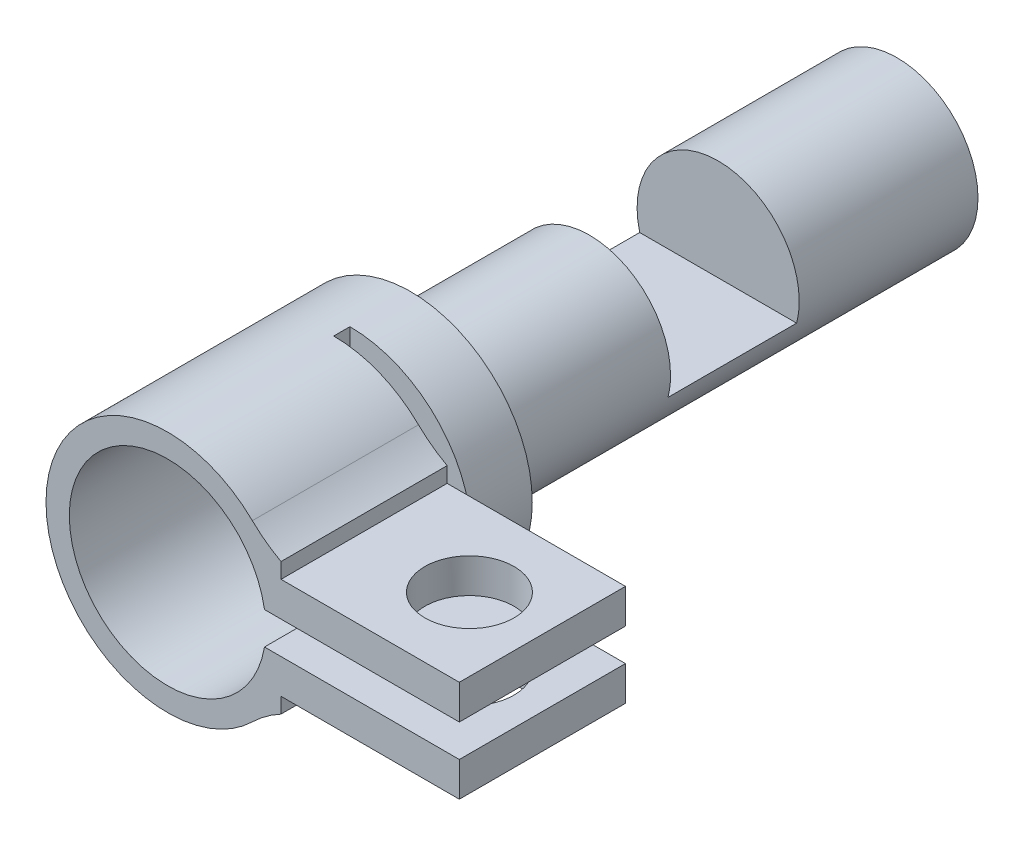
ISO-10303-21;
HEADER;
FILE_DESCRIPTION(('STEP AP214'),'2;1');
FILE_NAME('part.step','',(''),(''),'','','');
FILE_SCHEMA(('AUTOMOTIVE_DESIGN { 1 0 10303 214 1 1 1 1 }'));
ENDSEC;
DATA;
#1=APPLICATION_CONTEXT('core data for automotive mechanical design processes');
#2=APPLICATION_PROTOCOL_DEFINITION('international standard','automotive_design',2000,#1);
#3=PRODUCT_CONTEXT('',#1,'mechanical');
#4=PRODUCT('Part','Part','',(#3));
#5=PRODUCT_RELATED_PRODUCT_CATEGORY('part','',(#4));
#6=PRODUCT_DEFINITION_FORMATION('','',#4);
#7=PRODUCT_DEFINITION_CONTEXT('part definition',#1,'design');
#8=PRODUCT_DEFINITION('design','',#6,#7);
#9=PRODUCT_DEFINITION_SHAPE('','',#8);
#10=(LENGTH_UNIT() NAMED_UNIT(*) SI_UNIT(.MILLI.,.METRE.));
#11=(NAMED_UNIT(*) PLANE_ANGLE_UNIT() SI_UNIT($,.RADIAN.));
#12=(NAMED_UNIT(*) SI_UNIT($,.STERADIAN.) SOLID_ANGLE_UNIT());
#13=UNCERTAINTY_MEASURE_WITH_UNIT(LENGTH_MEASURE(1.E-05),#10,'distance_accuracy_value','');
#14=(GEOMETRIC_REPRESENTATION_CONTEXT(3) GLOBAL_UNCERTAINTY_ASSIGNED_CONTEXT((#13)) GLOBAL_UNIT_ASSIGNED_CONTEXT((#10,
#11,#12)) REPRESENTATION_CONTEXT('',''));
#15=CARTESIAN_POINT('',(0.,0.,0.));
#16=DIRECTION('',(0.,0.,1.));
#17=DIRECTION('',(1.,0.,0.));
#18=AXIS2_PLACEMENT_3D('',#15,#16,#17);
#19=CARTESIAN_POINT('',(0.,3.,0.));
#20=DIRECTION('',(0.,0.,-1.));
#21=DIRECTION('',(-1.,0.,0.));
#22=AXIS2_PLACEMENT_3D('',#19,#20,#21);
#23=PLANE('',#22);
#24=CARTESIAN_POINT('',(4.30697109347161,-4.425,0.));
#25=DIRECTION('',(0.,0.,-1.));
#26=DIRECTION('',(-1.,0.,0.));
#27=AXIS2_PLACEMENT_3D('',#24,#25,#26);
#28=CIRCLE('',#27,3.175);
#29=CARTESIAN_POINT('',(2.09245559197001,-2.1497975708502,0.));
#30=VERTEX_POINT('',#29);
#31=CARTESIAN_POINT('',(2.8,-1.63042255010869,0.));
#32=VERTEX_POINT('',#31);
#33=EDGE_CURVE('E63',#30,#32,#28,.T.);
#34=ORIENTED_EDGE('',*,*,#33,.T.);
#35=DIRECTION('',(0.,1.,0.));
#36=VECTOR('',#35,1.);
#37=CARTESIAN_POINT('',(2.8,-3.001,0.));
#38=LINE('',#37,#36);
#39=CARTESIAN_POINT('',(2.8,-1.25,0.));
#40=VERTEX_POINT('',#39);
#41=EDGE_CURVE('E203',#32,#40,#38,.T.);
#42=ORIENTED_EDGE('',*,*,#41,.T.);
#43=DIRECTION('',(1.,0.,0.));
#44=VECTOR('',#43,1.);
#45=CARTESIAN_POINT('',(7.2,-1.25,0.));
#46=LINE('',#45,#44);
#47=CARTESIAN_POINT('',(7.2,-1.25,0.));
#48=VERTEX_POINT('',#47);
#49=EDGE_CURVE('E188',#40,#48,#46,.T.);
#50=ORIENTED_EDGE('',*,*,#49,.T.);
#51=DIRECTION('',(0.,-1.,0.));
#52=VECTOR('',#51,1.);
#53=CARTESIAN_POINT('',(7.2,1.25,0.));
#54=LINE('',#53,#52);
#55=CARTESIAN_POINT('',(7.2,-0.4,0.));
#56=VERTEX_POINT('',#55);
#57=EDGE_CURVE('E328',#56,#48,#54,.T.);
#58=ORIENTED_EDGE('',*,*,#57,.F.);
#59=DIRECTION('',(1.,0.,0.));
#60=VECTOR('',#59,1.);
#61=CARTESIAN_POINT('',(0.,-0.4,0.));
#62=LINE('',#61,#60);
#63=CARTESIAN_POINT('',(2.3917828078653,-0.4,0.));
#64=VERTEX_POINT('',#63);
#65=EDGE_CURVE('E303',#64,#56,#62,.T.);
#66=ORIENTED_EDGE('',*,*,#65,.F.);
#67=CARTESIAN_POINT('',(0.,0.,0.));
#68=DIRECTION('',(0.,0.,1.));
#69=DIRECTION('',(1.,0.,0.));
#70=AXIS2_PLACEMENT_3D('',#67,#68,#69);
#71=CIRCLE('',#70,2.425);
#72=CARTESIAN_POINT('',(2.3917828078653,0.4,0.));
#73=VERTEX_POINT('',#72);
#74=EDGE_CURVE('E343',#73,#64,#71,.T.);
#75=ORIENTED_EDGE('',*,*,#74,.F.);
#76=DIRECTION('',(1.,0.,0.));
#77=VECTOR('',#76,1.);
#78=CARTESIAN_POINT('',(0.,0.4,0.));
#79=LINE('',#78,#77);
#80=CARTESIAN_POINT('',(7.2,0.4,0.));
#81=VERTEX_POINT('',#80);
#82=EDGE_CURVE('E302',#73,#81,#79,.T.);
#83=ORIENTED_EDGE('',*,*,#82,.T.);
#84=CARTESIAN_POINT('',(7.2,1.25,0.));
#85=VERTEX_POINT('',#84);
#86=EDGE_CURVE('E332',#85,#81,#54,.T.);
#87=ORIENTED_EDGE('',*,*,#86,.F.);
#88=DIRECTION('',(1.,0.,0.));
#89=VECTOR('',#88,1.);
#90=CARTESIAN_POINT('',(3.,1.25,0.));
#91=LINE('',#90,#89);
#92=CARTESIAN_POINT('',(2.8,1.25,0.));
#93=VERTEX_POINT('',#92);
#94=EDGE_CURVE('E322',#93,#85,#91,.T.);
#95=ORIENTED_EDGE('',*,*,#94,.F.);
#96=DIRECTION('',(0.,-1.,0.));
#97=VECTOR('',#96,1.);
#98=CARTESIAN_POINT('',(2.8,3.001,0.));
#99=LINE('',#98,#97);
#100=CARTESIAN_POINT('',(2.8,1.63042255010869,0.));
#101=VERTEX_POINT('',#100);
#102=EDGE_CURVE('E222',#101,#93,#99,.T.);
#103=ORIENTED_EDGE('',*,*,#102,.F.);
#104=CARTESIAN_POINT('',(4.30697109347161,4.425,0.));
#105=DIRECTION('',(0.,0.,-1.));
#106=DIRECTION('',(-1.,0.,0.));
#107=AXIS2_PLACEMENT_3D('',#104,#105,#106);
#108=CIRCLE('',#107,3.175);
#109=CARTESIAN_POINT('',(2.09245559197001,2.1497975708502,0.));
#110=VERTEX_POINT('',#109);
#111=EDGE_CURVE('E71',#101,#110,#108,.T.);
#112=ORIENTED_EDGE('',*,*,#111,.T.);
#113=CARTESIAN_POINT('',(0.,0.,0.));
#114=DIRECTION('',(0.,0.,1.));
#115=DIRECTION('',(1.,0.,0.));
#116=AXIS2_PLACEMENT_3D('',#113,#114,#115);
#117=CIRCLE('',#116,3.);
#118=EDGE_CURVE('E347',#110,#30,#117,.T.);
#119=ORIENTED_EDGE('',*,*,#118,.T.);
#120=EDGE_LOOP('',(#34,#42,#50,#58,#66,#75,#83,#87,#95,#103,#112,#119));
#121=FACE_BOUND('',#120,.T.);
#122=ADVANCED_FACE('F46',(#121),#23,.F.);
#123=CARTESIAN_POINT('',(0.,0.,-4.1));
#124=DIRECTION('',(0.,0.,-1.));
#125=DIRECTION('',(-1.,0.,0.));
#126=AXIS2_PLACEMENT_3D('',#123,#124,#125);
#127=PLANE('',#126);
#128=CARTESIAN_POINT('',(4.30697109347161,4.425,-4.1));
#129=DIRECTION('',(0.,0.,-1.));
#130=DIRECTION('',(-1.,0.,0.));
#131=AXIS2_PLACEMENT_3D('',#128,#129,#130);
#132=CIRCLE('',#131,3.175);
#133=CARTESIAN_POINT('',(2.09245559197001,2.1497975708502,-4.1));
#134=VERTEX_POINT('',#133);
#135=CARTESIAN_POINT('',(2.8,1.63042255010869,-4.1));
#136=VERTEX_POINT('',#135);
#137=EDGE_CURVE('E473',#134,#136,#132,.F.);
#138=ORIENTED_EDGE('',*,*,#137,.T.);
#139=DIRECTION('',(0.,-1.,0.));
#140=VECTOR('',#139,1.);
#141=CARTESIAN_POINT('',(2.8,3.001,-4.1));
#142=LINE('',#141,#140);
#143=CARTESIAN_POINT('',(2.8,1.25,-4.1));
#144=VERTEX_POINT('',#143);
#145=EDGE_CURVE('E226',#136,#144,#142,.T.);
#146=ORIENTED_EDGE('',*,*,#145,.T.);
#147=DIRECTION('',(1.,0.,0.));
#148=VECTOR('',#147,1.);
#149=CARTESIAN_POINT('',(0.,1.25,-4.1));
#150=LINE('',#149,#148);
#151=CARTESIAN_POINT('',(7.2,1.25,-4.1));
#152=VERTEX_POINT('',#151);
#153=EDGE_CURVE('E263',#144,#152,#150,.T.);
#154=ORIENTED_EDGE('',*,*,#153,.T.);
#155=DIRECTION('',(0.,-1.,0.));
#156=VECTOR('',#155,1.);
#157=CARTESIAN_POINT('',(7.2,1.25,-4.1));
#158=LINE('',#157,#156);
#159=CARTESIAN_POINT('',(7.2,0.4,-4.1));
#160=VERTEX_POINT('',#159);
#161=EDGE_CURVE('E260',#152,#160,#158,.T.);
#162=ORIENTED_EDGE('',*,*,#161,.T.);
#163=DIRECTION('',(-1.,0.,0.));
#164=VECTOR('',#163,1.);
#165=CARTESIAN_POINT('',(0.,0.4,-4.1));
#166=LINE('',#165,#164);
#167=CARTESIAN_POINT('',(2.3917828078653,0.4,-4.1));
#168=VERTEX_POINT('',#167);
#169=EDGE_CURVE('E362',#160,#168,#166,.T.);
#170=ORIENTED_EDGE('',*,*,#169,.T.);
#171=CARTESIAN_POINT('',(0.,0.,-4.1));
#172=DIRECTION('',(0.,0.,-1.));
#173=DIRECTION('',(-1.,0.,0.));
#174=AXIS2_PLACEMENT_3D('',#171,#172,#173);
#175=CIRCLE('',#174,2.425);
#176=CARTESIAN_POINT('',(0.,2.425,-4.1));
#177=VERTEX_POINT('',#176);
#178=EDGE_CURVE('E270',#168,#177,#175,.F.);
#179=ORIENTED_EDGE('',*,*,#178,.T.);
#180=DIRECTION('',(0.,1.,0.));
#181=VECTOR('',#180,1.);
#182=CARTESIAN_POINT('',(0.,2.425,-4.1));
#183=LINE('',#182,#181);
#184=CARTESIAN_POINT('',(0.,3.,-4.1));
#185=VERTEX_POINT('',#184);
#186=EDGE_CURVE('E251',#177,#185,#183,.T.);
#187=ORIENTED_EDGE('',*,*,#186,.T.);
#188=CARTESIAN_POINT('',(0.,0.,-4.1));
#189=DIRECTION('',(0.,0.,-1.));
#190=DIRECTION('',(-1.,0.,0.));
#191=AXIS2_PLACEMENT_3D('',#188,#189,#190);
#192=CIRCLE('',#191,3.);
#193=EDGE_CURVE('E266',#185,#134,#192,.T.);
#194=ORIENTED_EDGE('',*,*,#193,.T.);
#195=EDGE_LOOP('',(#138,#146,#154,#162,#170,#179,#187,#194));
#196=FACE_BOUND('',#195,.T.);
#197=ADVANCED_FACE('F406',(#196),#127,.T.);
#198=CARTESIAN_POINT('',(4.30697109347161,4.425,12.7858627858648));
#199=DIRECTION('',(0.,0.,1.));
#200=DIRECTION('',(1.,0.,0.));
#201=AXIS2_PLACEMENT_3D('',#198,#199,#200);
#202=CYLINDRICAL_SURFACE('',#201,3.175);
#203=DIRECTION('',(0.,0.,1.));
#204=VECTOR('',#203,1.);
#205=CARTESIAN_POINT('',(2.8,1.63042255010869,12.7858627858648));
#206=LINE('',#205,#204);
#207=EDGE_CURVE('E210',#101,#136,#206,.F.);
#208=ORIENTED_EDGE('',*,*,#207,.T.);
#209=ORIENTED_EDGE('',*,*,#137,.F.);
#210=DIRECTION('',(0.,0.,1.));
#211=VECTOR('',#210,1.);
#212=CARTESIAN_POINT('',(2.09245559197001,2.1497975708502,12.7858627858648));
#213=LINE('',#212,#211);
#214=EDGE_CURVE('E385',#110,#134,#213,.F.);
#215=ORIENTED_EDGE('',*,*,#214,.F.);
#216=ORIENTED_EDGE('',*,*,#111,.F.);
#217=EDGE_LOOP('',(#208,#209,#215,#216));
#218=FACE_BOUND('',#217,.T.);
#219=ADVANCED_FACE('F401',(#218),#202,.F.);
#220=CARTESIAN_POINT('',(0.,0.,12.7858627858648));
#221=DIRECTION('',(0.,0.,1.));
#222=DIRECTION('',(1.,0.,0.));
#223=AXIS2_PLACEMENT_3D('',#220,#221,#222);
#224=CYLINDRICAL_SURFACE('',#223,2.);
#225=CARTESIAN_POINT('',(0.,0.,-18.));
#226=DIRECTION('',(0.,0.,1.));
#227=DIRECTION('',(1.,0.,0.));
#228=AXIS2_PLACEMENT_3D('',#225,#226,#227);
#229=CIRCLE('',#228,2.);
#230=CARTESIAN_POINT('',(2.,0.,-18.));
#231=VERTEX_POINT('',#230);
#232=EDGE_CURVE('E358',#231,#231,#229,.T.);
#233=ORIENTED_EDGE('',*,*,#232,.T.);
#234=EDGE_LOOP('',(#233));
#235=FACE_BOUND('',#234,.T.);
#236=CARTESIAN_POINT('',(0.,0.,-6.));
#237=DIRECTION('',(0.,0.,1.));
#238=DIRECTION('',(1.,0.,0.));
#239=AXIS2_PLACEMENT_3D('',#236,#237,#238);
#240=CIRCLE('',#239,2.);
#241=CARTESIAN_POINT('',(2.,0.,-6.));
#242=VERTEX_POINT('',#241);
#243=EDGE_CURVE('E354',#242,#242,#240,.T.);
#244=ORIENTED_EDGE('',*,*,#243,.F.);
#245=EDGE_LOOP('',(#244));
#246=FACE_BOUND('',#245,.T.);
#247=DIRECTION('',(0.,0.,1.));
#248=VECTOR('',#247,1.);
#249=CARTESIAN_POINT('',(-1.93649167310371,-0.5,12.7858627858648));
#250=LINE('',#249,#248);
#251=CARTESIAN_POINT('',(-1.93649167310371,-0.5,-13.5875));
#252=VERTEX_POINT('',#251);
#253=CARTESIAN_POINT('',(-1.93649167310371,-0.5,-10.4125));
#254=VERTEX_POINT('',#253);
#255=EDGE_CURVE('E379',#252,#254,#250,.T.);
#256=ORIENTED_EDGE('',*,*,#255,.F.);
#257=CARTESIAN_POINT('',(0.,0.,-13.5875));
#258=DIRECTION('',(0.,0.,-1.));
#259=DIRECTION('',(-1.,0.,0.));
#260=AXIS2_PLACEMENT_3D('',#257,#258,#259);
#261=CIRCLE('',#260,2.);
#262=CARTESIAN_POINT('',(1.93649167310371,-0.5,-13.5875));
#263=VERTEX_POINT('',#262);
#264=EDGE_CURVE('E371',#252,#263,#261,.T.);
#265=ORIENTED_EDGE('',*,*,#264,.T.);
#266=DIRECTION('',(0.,0.,1.));
#267=VECTOR('',#266,1.);
#268=CARTESIAN_POINT('',(1.93649167310371,-0.5,12.7858627858648));
#269=LINE('',#268,#267);
#270=CARTESIAN_POINT('',(1.93649167310371,-0.5,-10.4125));
#271=VERTEX_POINT('',#270);
#272=EDGE_CURVE('E365',#271,#263,#269,.F.);
#273=ORIENTED_EDGE('',*,*,#272,.F.);
#274=CARTESIAN_POINT('',(0.,0.,-10.4125));
#275=DIRECTION('',(0.,0.,1.));
#276=DIRECTION('',(1.,0.,0.));
#277=AXIS2_PLACEMENT_3D('',#274,#275,#276);
#278=CIRCLE('',#277,2.);
#279=EDGE_CURVE('E375',#271,#254,#278,.T.);
#280=ORIENTED_EDGE('',*,*,#279,.T.);
#281=EDGE_LOOP('',(#256,#265,#273,#280));
#282=FACE_BOUND('',#281,.T.);
#283=ADVANCED_FACE('F405',(#235,#246,#282),#224,.T.);
#284=CARTESIAN_POINT('',(7.2,1.25,-4.5));
#285=DIRECTION('',(-1.,0.,0.));
#286=DIRECTION('',(0.,0.,1.));
#287=AXIS2_PLACEMENT_3D('',#284,#285,#286);
#288=PLANE('',#287);
#289=DIRECTION('',(0.,-1.,0.));
#290=VECTOR('',#289,1.);
#291=CARTESIAN_POINT('',(7.2,1.25,-4.1));
#292=LINE('',#291,#290);
#293=CARTESIAN_POINT('',(7.2,-0.4,-4.1));
#294=VERTEX_POINT('',#293);
#295=CARTESIAN_POINT('',(7.2,-1.25,-4.1));
#296=VERTEX_POINT('',#295);
#297=EDGE_CURVE('E279',#294,#296,#292,.T.);
#298=ORIENTED_EDGE('',*,*,#297,.F.);
#299=DIRECTION('',(0.,0.,-1.));
#300=VECTOR('',#299,1.);
#301=CARTESIAN_POINT('',(7.2,-0.4,0.));
#302=LINE('',#301,#300);
#303=EDGE_CURVE('E306',#56,#294,#302,.T.);
#304=ORIENTED_EDGE('',*,*,#303,.F.);
#305=ORIENTED_EDGE('',*,*,#57,.T.);
#306=DIRECTION('',(0.,0.,-1.));
#307=VECTOR('',#306,1.);
#308=CARTESIAN_POINT('',(7.2,-1.25,-4.5));
#309=LINE('',#308,#307);
#310=EDGE_CURVE('E193',#48,#296,#309,.T.);
#311=ORIENTED_EDGE('',*,*,#310,.T.);
#312=EDGE_LOOP('',(#298,#304,#305,#311));
#313=FACE_BOUND('',#312,.T.);
#314=ADVANCED_FACE('F416',(#313),#288,.F.);
#315=CARTESIAN_POINT('',(0.,0.,12.7858627858648));
#316=DIRECTION('',(0.,0.,1.));
#317=DIRECTION('',(1.,0.,0.));
#318=AXIS2_PLACEMENT_3D('',#315,#316,#317);
#319=CYLINDRICAL_SURFACE('',#318,3.);
#320=CARTESIAN_POINT('',(0.,0.,-6.));
#321=DIRECTION('',(0.,0.,1.));
#322=DIRECTION('',(1.,0.,0.));
#323=AXIS2_PLACEMENT_3D('',#320,#321,#322);
#324=CIRCLE('',#323,3.);
#325=CARTESIAN_POINT('',(3.,0.,-6.));
#326=VERTEX_POINT('',#325);
#327=EDGE_CURVE('E350',#326,#326,#324,.T.);
#328=ORIENTED_EDGE('',*,*,#327,.T.);
#329=EDGE_LOOP('',(#328));
#330=FACE_BOUND('',#329,.T.);
#331=ORIENTED_EDGE('',*,*,#118,.F.);
#332=ORIENTED_EDGE('',*,*,#214,.T.);
#333=ORIENTED_EDGE('',*,*,#193,.F.);
#334=DIRECTION('',(0.,0.,1.));
#335=VECTOR('',#334,1.);
#336=CARTESIAN_POINT('',(0.,3.,12.7858627858648));
#337=LINE('',#336,#335);
#338=CARTESIAN_POINT('',(0.,3.,-4.5));
#339=VERTEX_POINT('',#338);
#340=EDGE_CURVE('E286',#185,#339,#337,.F.);
#341=ORIENTED_EDGE('',*,*,#340,.T.);
#342=CARTESIAN_POINT('',(0.,0.,-4.5));
#343=DIRECTION('',(0.,0.,1.));
#344=DIRECTION('',(1.,0.,0.));
#345=AXIS2_PLACEMENT_3D('',#342,#343,#344);
#346=CIRCLE('',#345,3.);
#347=CARTESIAN_POINT('',(0.,-3.,-4.5));
#348=VERTEX_POINT('',#347);
#349=EDGE_CURVE('E336',#348,#339,#346,.T.);
#350=ORIENTED_EDGE('',*,*,#349,.F.);
#351=DIRECTION('',(0.,0.,1.));
#352=VECTOR('',#351,1.);
#353=CARTESIAN_POINT('',(0.,-3.,12.7858627858648));
#354=LINE('',#353,#352);
#355=CARTESIAN_POINT('',(0.,-3.,-4.1));
#356=VERTEX_POINT('',#355);
#357=EDGE_CURVE('E290',#348,#356,#354,.T.);
#358=ORIENTED_EDGE('',*,*,#357,.T.);
#359=CARTESIAN_POINT('',(2.09245559197001,-2.1497975708502,-4.1));
#360=VERTEX_POINT('',#359);
#361=EDGE_CURVE('E271',#360,#356,#192,.T.);
#362=ORIENTED_EDGE('',*,*,#361,.F.);
#363=DIRECTION('',(0.,0.,1.));
#364=VECTOR('',#363,1.);
#365=CARTESIAN_POINT('',(2.09245559197001,-2.1497975708502,12.7858627858648));
#366=LINE('',#365,#364);
#367=EDGE_CURVE('E382',#360,#30,#366,.T.);
#368=ORIENTED_EDGE('',*,*,#367,.T.);
#369=EDGE_LOOP('',(#331,#332,#333,#341,#350,#358,#362,#368));
#370=FACE_BOUND('',#369,.T.);
#371=ADVANCED_FACE('F422',(#330,#370),#319,.T.);
#372=CARTESIAN_POINT('',(0.,1.25,0.));
#373=DIRECTION('',(0.,-1.,0.));
#374=DIRECTION('',(0.,0.,-1.));
#375=AXIS2_PLACEMENT_3D('',#372,#373,#374);
#376=PLANE('',#375);
#377=DIRECTION('',(0.,0.,1.));
#378=VECTOR('',#377,1.);
#379=CARTESIAN_POINT('',(2.8,1.25,-4.1));
#380=LINE('',#379,#378);
#381=EDGE_CURVE('E215',#144,#93,#380,.T.);
#382=ORIENTED_EDGE('',*,*,#381,.T.);
#383=ORIENTED_EDGE('',*,*,#94,.T.);
#384=DIRECTION('',(0.,0.,-1.));
#385=VECTOR('',#384,1.);
#386=CARTESIAN_POINT('',(7.2,1.25,-4.5));
#387=LINE('',#386,#385);
#388=EDGE_CURVE('E325',#85,#152,#387,.T.);
#389=ORIENTED_EDGE('',*,*,#388,.T.);
#390=ORIENTED_EDGE('',*,*,#153,.F.);
#391=EDGE_LOOP('',(#382,#383,#389,#390));
#392=FACE_BOUND('',#391,.T.);
#393=CARTESIAN_POINT('',(5.4,1.25,-2.05));
#394=DIRECTION('',(0.,1.,0.));
#395=DIRECTION('',(0.,0.,1.));
#396=AXIS2_PLACEMENT_3D('',#393,#394,#395);
#397=CIRCLE('',#396,1.1);
#398=CARTESIAN_POINT('',(4.30697109347161,1.25,-1.9263561182535));
#399=VERTEX_POINT('',#398);
#400=CARTESIAN_POINT('',(4.30697109347161,1.25,-2.1736438817465));
#401=VERTEX_POINT('',#400);
#402=EDGE_CURVE('E237',#399,#401,#397,.T.);
#403=ORIENTED_EDGE('',*,*,#402,.F.);
#404=CARTESIAN_POINT('',(4.30697109347161,1.25,-2.1736438817465));
#405=CARTESIAN_POINT('',(4.30232369782387,1.25000510196354,-2.13242925449766));
#406=CARTESIAN_POINT('',(4.3,1.25000765294532,-2.09121462724883));
#407=CARTESIAN_POINT('',(4.3,1.25000765294532,-2.00878537275117));
#408=CARTESIAN_POINT('',(4.30232369782387,1.25000510196354,-1.96757074550233));
#409=CARTESIAN_POINT('',(4.30697109347161,1.25,-1.9263561182535));
#410=B_SPLINE_CURVE_WITH_KNOTS('',3,(#404,#405,#406,#407,#408,#409),.UNSPECIFIED.,.F.,.F.,(4,2,
4),(0.,0.123840242635821,0.247680485271643),.UNSPECIFIED.);
#411=EDGE_CURVE('E388',#401,#399,#410,.T.);
#412=ORIENTED_EDGE('',*,*,#411,.F.);
#413=EDGE_LOOP('',(#403,#412));
#414=FACE_BOUND('',#413,.T.);
#415=ADVANCED_FACE('F425',(#392,#414),#376,.F.);
#416=CARTESIAN_POINT('',(0.,-1.25,0.));
#417=DIRECTION('',(0.,-1.,0.));
#418=DIRECTION('',(0.,0.,-1.));
#419=AXIS2_PLACEMENT_3D('',#416,#417,#418);
#420=PLANE('',#419);
#421=CARTESIAN_POINT('',(4.30697109347161,-1.25,-1.92635611825351));
#422=CARTESIAN_POINT('',(4.30232369782387,-1.25000510196354,-1.96757074550234));
#423=CARTESIAN_POINT('',(4.3,-1.25000765294532,-2.00878537275117));
#424=CARTESIAN_POINT('',(4.3,-1.25000765294532,-2.09121462724883));
#425=CARTESIAN_POINT('',(4.30232369782387,-1.25000510196354,-2.13242925449766));
#426=CARTESIAN_POINT('',(4.30697109347161,-1.25,-2.17364388174649));
#427=B_SPLINE_CURVE_WITH_KNOTS('',3,(#421,#422,#423,#424,#425,#426),.UNSPECIFIED.,.F.,.F.,(4,2,
4),(0.,0.123840242635817,0.247680485271634),.UNSPECIFIED.);
#428=CARTESIAN_POINT('',(4.30697109347161,-1.25,-1.92635611825351));
#429=VERTEX_POINT('',#428);
#430=CARTESIAN_POINT('',(4.30697109347161,-1.25,-2.17364388174649));
#431=VERTEX_POINT('',#430);
#432=EDGE_CURVE('E56',#429,#431,#427,.T.);
#433=ORIENTED_EDGE('',*,*,#432,.F.);
#434=CARTESIAN_POINT('',(5.4,-1.25,-2.05));
#435=DIRECTION('',(0.,-1.,0.));
#436=DIRECTION('',(0.,0.,-1.));
#437=AXIS2_PLACEMENT_3D('',#434,#435,#436);
#438=CIRCLE('',#437,1.1);
#439=EDGE_CURVE('E246',#431,#429,#438,.T.);
#440=ORIENTED_EDGE('',*,*,#439,.F.);
#441=EDGE_LOOP('',(#433,#440));
#442=FACE_BOUND('',#441,.T.);
#443=ORIENTED_EDGE('',*,*,#49,.F.);
#444=DIRECTION('',(0.,0.,1.));
#445=VECTOR('',#444,1.);
#446=CARTESIAN_POINT('',(2.8,-1.25,-4.1));
#447=LINE('',#446,#445);
#448=CARTESIAN_POINT('',(2.8,-1.25,-4.1));
#449=VERTEX_POINT('',#448);
#450=EDGE_CURVE('E191',#449,#40,#447,.T.);
#451=ORIENTED_EDGE('',*,*,#450,.F.);
#452=DIRECTION('',(1.,0.,0.));
#453=VECTOR('',#452,1.);
#454=CARTESIAN_POINT('',(0.,-1.25,-4.1));
#455=LINE('',#454,#453);
#456=EDGE_CURVE('E283',#449,#296,#455,.T.);
#457=ORIENTED_EDGE('',*,*,#456,.T.);
#458=ORIENTED_EDGE('',*,*,#310,.F.);
#459=EDGE_LOOP('',(#443,#451,#457,#458));
#460=FACE_BOUND('',#459,.T.);
#461=ADVANCED_FACE('F190',(#442,#460),#420,.T.);
#462=ORIENTED_EDGE('',*,*,#161,.F.);
#463=ORIENTED_EDGE('',*,*,#388,.F.);
#464=ORIENTED_EDGE('',*,*,#86,.T.);
#465=DIRECTION('',(0.,0.,-1.));
#466=VECTOR('',#465,1.);
#467=CARTESIAN_POINT('',(7.2,0.4,0.));
#468=LINE('',#467,#466);
#469=EDGE_CURVE('E307',#81,#160,#468,.T.);
#470=ORIENTED_EDGE('',*,*,#469,.T.);
#471=EDGE_LOOP('',(#462,#463,#464,#470));
#472=FACE_BOUND('',#471,.T.);
#473=ADVANCED_FACE('F440',(#472),#288,.F.);
#474=CARTESIAN_POINT('',(0.,-0.4,0.));
#475=DIRECTION('',(0.,1.,0.));
#476=DIRECTION('',(0.,0.,1.));
#477=AXIS2_PLACEMENT_3D('',#474,#475,#476);
#478=PLANE('',#477);
#479=CARTESIAN_POINT('',(5.4,-0.4,-2.05));
#480=DIRECTION('',(0.,1.,0.));
#481=DIRECTION('',(0.,0.,1.));
#482=AXIS2_PLACEMENT_3D('',#479,#480,#481);
#483=CIRCLE('',#482,1.1);
#484=CARTESIAN_POINT('',(5.4,-0.4,-0.95));
#485=VERTEX_POINT('',#484);
#486=EDGE_CURVE('E241',#485,#485,#483,.T.);
#487=ORIENTED_EDGE('',*,*,#486,.F.);
#488=EDGE_LOOP('',(#487));
#489=FACE_BOUND('',#488,.T.);
#490=ORIENTED_EDGE('',*,*,#303,.T.);
#491=DIRECTION('',(-1.,0.,0.));
#492=VECTOR('',#491,1.);
#493=CARTESIAN_POINT('',(0.,-0.4,-4.1));
#494=LINE('',#493,#492);
#495=CARTESIAN_POINT('',(2.3917828078653,-0.4,-4.1));
#496=VERTEX_POINT('',#495);
#497=EDGE_CURVE('E274',#294,#496,#494,.T.);
#498=ORIENTED_EDGE('',*,*,#497,.T.);
#499=DIRECTION('',(0.,0.,1.));
#500=VECTOR('',#499,1.);
#501=CARTESIAN_POINT('',(2.3917828078653,-0.4,12.7858627858648));
#502=LINE('',#501,#500);
#503=EDGE_CURVE('E198',#496,#64,#502,.T.);
#504=ORIENTED_EDGE('',*,*,#503,.T.);
#505=ORIENTED_EDGE('',*,*,#65,.T.);
#506=EDGE_LOOP('',(#490,#498,#504,#505));
#507=FACE_BOUND('',#506,.T.);
#508=ADVANCED_FACE('F449',(#489,#507),#478,.T.);
#509=CARTESIAN_POINT('',(0.,0.4,0.));
#510=DIRECTION('',(0.,1.,0.));
#511=DIRECTION('',(0.,0.,1.));
#512=AXIS2_PLACEMENT_3D('',#509,#510,#511);
#513=PLANE('',#512);
#514=CARTESIAN_POINT('',(5.4,0.4,-2.05));
#515=DIRECTION('',(0.,1.,0.));
#516=DIRECTION('',(0.,0.,1.));
#517=AXIS2_PLACEMENT_3D('',#514,#515,#516);
#518=CIRCLE('',#517,1.1);
#519=CARTESIAN_POINT('',(5.4,0.4,-0.95));
#520=VERTEX_POINT('',#519);
#521=EDGE_CURVE('E242',#520,#520,#518,.T.);
#522=ORIENTED_EDGE('',*,*,#521,.T.);
#523=EDGE_LOOP('',(#522));
#524=FACE_BOUND('',#523,.T.);
#525=ORIENTED_EDGE('',*,*,#169,.F.);
#526=ORIENTED_EDGE('',*,*,#469,.F.);
#527=ORIENTED_EDGE('',*,*,#82,.F.);
#528=DIRECTION('',(0.,0.,1.));
#529=VECTOR('',#528,1.);
#530=CARTESIAN_POINT('',(2.3917828078653,0.4,12.7858627858648));
#531=LINE('',#530,#529);
#532=EDGE_CURVE('E311',#168,#73,#531,.T.);
#533=ORIENTED_EDGE('',*,*,#532,.F.);
#534=EDGE_LOOP('',(#525,#526,#527,#533));
#535=FACE_BOUND('',#534,.T.);
#536=ADVANCED_FACE('F431',(#524,#535),#513,.F.);
#537=CARTESIAN_POINT('',(0.,0.,12.7858627858648));
#538=DIRECTION('',(0.,0.,1.));
#539=DIRECTION('',(1.,0.,0.));
#540=AXIS2_PLACEMENT_3D('',#537,#538,#539);
#541=CYLINDRICAL_SURFACE('',#540,2.425);
#542=CARTESIAN_POINT('',(0.,-2.425,-4.1));
#543=VERTEX_POINT('',#542);
#544=EDGE_CURVE('E275',#543,#496,#175,.F.);
#545=ORIENTED_EDGE('',*,*,#544,.F.);
#546=DIRECTION('',(0.,0.,1.));
#547=VECTOR('',#546,1.);
#548=CARTESIAN_POINT('',(0.,-2.425,12.7858627858648));
#549=LINE('',#548,#547);
#550=CARTESIAN_POINT('',(0.,-2.425,-4.5));
#551=VERTEX_POINT('',#550);
#552=EDGE_CURVE('E298',#543,#551,#549,.F.);
#553=ORIENTED_EDGE('',*,*,#552,.T.);
#554=CARTESIAN_POINT('',(0.,0.,-4.5));
#555=DIRECTION('',(0.,0.,1.));
#556=DIRECTION('',(1.,0.,0.));
#557=AXIS2_PLACEMENT_3D('',#554,#555,#556);
#558=CIRCLE('',#557,2.425);
#559=CARTESIAN_POINT('',(0.,2.425,-4.5));
#560=VERTEX_POINT('',#559);
#561=EDGE_CURVE('E339',#560,#551,#558,.T.);
#562=ORIENTED_EDGE('',*,*,#561,.F.);
#563=DIRECTION('',(0.,0.,1.));
#564=VECTOR('',#563,1.);
#565=CARTESIAN_POINT('',(0.,2.425,12.7858627858648));
#566=LINE('',#565,#564);
#567=EDGE_CURVE('E294',#560,#177,#566,.T.);
#568=ORIENTED_EDGE('',*,*,#567,.T.);
#569=ORIENTED_EDGE('',*,*,#178,.F.);
#570=ORIENTED_EDGE('',*,*,#532,.T.);
#571=ORIENTED_EDGE('',*,*,#74,.T.);
#572=ORIENTED_EDGE('',*,*,#503,.F.);
#573=EDGE_LOOP('',(#545,#553,#562,#568,#569,#570,#571,#572));
#574=FACE_BOUND('',#573,.T.);
#575=ADVANCED_FACE('F412',(#574),#541,.F.);
#576=CARTESIAN_POINT('',(0.,0.,-18.));
#577=DIRECTION('',(0.,0.,1.));
#578=DIRECTION('',(1.,0.,0.));
#579=AXIS2_PLACEMENT_3D('',#576,#577,#578);
#580=PLANE('',#579);
#581=ORIENTED_EDGE('',*,*,#232,.F.);
#582=EDGE_LOOP('',(#581));
#583=FACE_BOUND('',#582,.T.);
#584=ADVANCED_FACE('F408',(#583),#580,.F.);
#585=CARTESIAN_POINT('',(0.,2.,-6.));
#586=DIRECTION('',(0.,0.,1.));
#587=DIRECTION('',(1.,0.,0.));
#588=AXIS2_PLACEMENT_3D('',#585,#586,#587);
#589=PLANE('',#588);
#590=ORIENTED_EDGE('',*,*,#327,.F.);
#591=EDGE_LOOP('',(#590));
#592=FACE_BOUND('',#591,.T.);
#593=ORIENTED_EDGE('',*,*,#243,.T.);
#594=EDGE_LOOP('',(#593));
#595=FACE_BOUND('',#594,.T.);
#596=ADVANCED_FACE('F411',(#592,#595),#589,.F.);
#597=CARTESIAN_POINT('',(0.,2.425,-4.5));
#598=DIRECTION('',(0.,0.,-1.));
#599=DIRECTION('',(-1.,0.,0.));
#600=AXIS2_PLACEMENT_3D('',#597,#598,#599);
#601=PLANE('',#600);
#602=DIRECTION('',(0.,1.,0.));
#603=VECTOR('',#602,1.);
#604=CARTESIAN_POINT('',(0.,2.425,-4.5));
#605=LINE('',#604,#603);
#606=EDGE_CURVE('E250',#560,#339,#605,.T.);
#607=ORIENTED_EDGE('',*,*,#606,.F.);
#608=ORIENTED_EDGE('',*,*,#561,.T.);
#609=EDGE_CURVE('E256',#348,#551,#605,.T.);
#610=ORIENTED_EDGE('',*,*,#609,.F.);
#611=ORIENTED_EDGE('',*,*,#349,.T.);
#612=EDGE_LOOP('',(#607,#608,#610,#611));
#613=FACE_BOUND('',#612,.T.);
#614=ADVANCED_FACE('F420',(#613),#601,.F.);
#615=CARTESIAN_POINT('',(0.,2.425,-4.1));
#616=DIRECTION('',(-1.,0.,0.));
#617=DIRECTION('',(0.,0.,1.));
#618=AXIS2_PLACEMENT_3D('',#615,#616,#617);
#619=PLANE('',#618);
#620=ORIENTED_EDGE('',*,*,#606,.T.);
#621=ORIENTED_EDGE('',*,*,#340,.F.);
#622=ORIENTED_EDGE('',*,*,#186,.F.);
#623=ORIENTED_EDGE('',*,*,#567,.F.);
#624=EDGE_LOOP('',(#620,#621,#622,#623));
#625=FACE_BOUND('',#624,.T.);
#626=ADVANCED_FACE('F435',(#625),#619,.F.);
#627=EDGE_CURVE('E255',#356,#543,#183,.T.);
#628=ORIENTED_EDGE('',*,*,#627,.F.);
#629=ORIENTED_EDGE('',*,*,#357,.F.);
#630=ORIENTED_EDGE('',*,*,#609,.T.);
#631=ORIENTED_EDGE('',*,*,#552,.F.);
#632=EDGE_LOOP('',(#628,#629,#630,#631));
#633=FACE_BOUND('',#632,.T.);
#634=ADVANCED_FACE('F454',(#633),#619,.F.);
#635=DIRECTION('',(0.,1.,0.));
#636=VECTOR('',#635,1.);
#637=CARTESIAN_POINT('',(2.8,-3.001,-4.1));
#638=LINE('',#637,#636);
#639=CARTESIAN_POINT('',(2.8,-1.63042255010869,-4.1));
#640=VERTEX_POINT('',#639);
#641=EDGE_CURVE('E205',#640,#449,#638,.T.);
#642=ORIENTED_EDGE('',*,*,#641,.F.);
#643=CARTESIAN_POINT('',(4.30697109347161,-4.425,-4.1));
#644=DIRECTION('',(0.,0.,-1.));
#645=DIRECTION('',(-1.,0.,0.));
#646=AXIS2_PLACEMENT_3D('',#643,#644,#645);
#647=CIRCLE('',#646,3.175);
#648=EDGE_CURVE('E11',#640,#360,#647,.F.);
#649=ORIENTED_EDGE('',*,*,#648,.T.);
#650=ORIENTED_EDGE('',*,*,#361,.T.);
#651=ORIENTED_EDGE('',*,*,#627,.T.);
#652=ORIENTED_EDGE('',*,*,#544,.T.);
#653=ORIENTED_EDGE('',*,*,#497,.F.);
#654=ORIENTED_EDGE('',*,*,#297,.T.);
#655=ORIENTED_EDGE('',*,*,#456,.F.);
#656=EDGE_LOOP('',(#642,#649,#650,#651,#652,#653,#654,#655));
#657=FACE_BOUND('',#656,.T.);
#658=ADVANCED_FACE('F456',(#657),#127,.T.);
#659=CARTESIAN_POINT('',(5.4,1.25,-2.05));
#660=DIRECTION('',(0.,1.,0.));
#661=DIRECTION('',(0.,0.,1.));
#662=AXIS2_PLACEMENT_3D('',#659,#660,#661);
#663=CYLINDRICAL_SURFACE('',#662,1.1);
#664=ORIENTED_EDGE('',*,*,#439,.T.);
#665=ORIENTED_EDGE('',*,*,#432,.T.);
#666=EDGE_LOOP('',(#664,#665));
#667=FACE_BOUND('',#666,.T.);
#668=ORIENTED_EDGE('',*,*,#486,.T.);
#669=EDGE_LOOP('',(#668));
#670=FACE_BOUND('',#669,.T.);
#671=ADVANCED_FACE('F397',(#667,#670),#663,.F.);
#672=ORIENTED_EDGE('',*,*,#402,.T.);
#673=ORIENTED_EDGE('',*,*,#411,.T.);
#674=EDGE_LOOP('',(#672,#673));
#675=FACE_BOUND('',#674,.T.);
#676=ORIENTED_EDGE('',*,*,#521,.F.);
#677=EDGE_LOOP('',(#676));
#678=FACE_BOUND('',#677,.T.);
#679=ADVANCED_FACE('F464',(#675,#678),#663,.F.);
#680=CARTESIAN_POINT('',(-5.,-0.5,-10.4125));
#681=DIRECTION('',(0.,0.,1.));
#682=DIRECTION('',(1.,0.,0.));
#683=AXIS2_PLACEMENT_3D('',#680,#681,#682);
#684=PLANE('',#683);
#685=DIRECTION('',(1.,0.,0.));
#686=VECTOR('',#685,1.);
#687=CARTESIAN_POINT('',(-5.,-0.5,-10.4125));
#688=LINE('',#687,#686);
#689=EDGE_CURVE('E234',#254,#271,#688,.T.);
#690=ORIENTED_EDGE('',*,*,#689,.F.);
#691=ORIENTED_EDGE('',*,*,#279,.F.);
#692=EDGE_LOOP('',(#690,#691));
#693=FACE_BOUND('',#692,.T.);
#694=ADVANCED_FACE('F676',(#693),#684,.F.);
#695=CARTESIAN_POINT('',(5.,-0.5,-13.5875));
#696=DIRECTION('',(0.,0.,-1.));
#697=DIRECTION('',(-1.,0.,0.));
#698=AXIS2_PLACEMENT_3D('',#695,#696,#697);
#699=PLANE('',#698);
#700=DIRECTION('',(-1.,0.,0.));
#701=VECTOR('',#700,1.);
#702=CARTESIAN_POINT('',(5.,-0.5,-13.5875));
#703=LINE('',#702,#701);
#704=EDGE_CURVE('E230',#263,#252,#703,.T.);
#705=ORIENTED_EDGE('',*,*,#704,.F.);
#706=ORIENTED_EDGE('',*,*,#264,.F.);
#707=EDGE_LOOP('',(#705,#706));
#708=FACE_BOUND('',#707,.T.);
#709=ADVANCED_FACE('F686',(#708),#699,.F.);
#710=CARTESIAN_POINT('',(0.,-0.5,0.));
#711=DIRECTION('',(0.,1.,0.));
#712=DIRECTION('',(0.,0.,1.));
#713=AXIS2_PLACEMENT_3D('',#710,#711,#712);
#714=PLANE('',#713);
#715=ORIENTED_EDGE('',*,*,#255,.T.);
#716=ORIENTED_EDGE('',*,*,#689,.T.);
#717=ORIENTED_EDGE('',*,*,#272,.T.);
#718=ORIENTED_EDGE('',*,*,#704,.T.);
#719=EDGE_LOOP('',(#715,#716,#717,#718));
#720=FACE_BOUND('',#719,.T.);
#721=ADVANCED_FACE('F694',(#720),#714,.T.);
#722=CARTESIAN_POINT('',(4.30697109347161,-4.425,12.7858627858648));
#723=DIRECTION('',(0.,0.,1.));
#724=DIRECTION('',(1.,0.,0.));
#725=AXIS2_PLACEMENT_3D('',#722,#723,#724);
#726=CYLINDRICAL_SURFACE('',#725,3.175);
#727=ORIENTED_EDGE('',*,*,#648,.F.);
#728=DIRECTION('',(0.,0.,1.));
#729=VECTOR('',#728,1.);
#730=CARTESIAN_POINT('',(2.8,-1.63042255010869,12.7858627858648));
#731=LINE('',#730,#729);
#732=EDGE_CURVE('E207',#32,#640,#731,.F.);
#733=ORIENTED_EDGE('',*,*,#732,.F.);
#734=ORIENTED_EDGE('',*,*,#33,.F.);
#735=ORIENTED_EDGE('',*,*,#367,.F.);
#736=EDGE_LOOP('',(#727,#733,#734,#735));
#737=FACE_BOUND('',#736,.T.);
#738=ADVANCED_FACE('F48',(#737),#726,.F.);
#739=CARTESIAN_POINT('',(2.8,3.001,-4.1));
#740=DIRECTION('',(1.,0.,0.));
#741=DIRECTION('',(0.,0.,-1.));
#742=AXIS2_PLACEMENT_3D('',#739,#740,#741);
#743=PLANE('',#742);
#744=ORIENTED_EDGE('',*,*,#102,.T.);
#745=ORIENTED_EDGE('',*,*,#381,.F.);
#746=ORIENTED_EDGE('',*,*,#145,.F.);
#747=ORIENTED_EDGE('',*,*,#207,.F.);
#748=EDGE_LOOP('',(#744,#745,#746,#747));
#749=FACE_BOUND('',#748,.T.);
#750=ADVANCED_FACE('F604',(#749),#743,.T.);
#751=CARTESIAN_POINT('',(2.8,-3.001,-4.1));
#752=DIRECTION('',(-1.,0.,0.));
#753=DIRECTION('',(0.,0.,1.));
#754=AXIS2_PLACEMENT_3D('',#751,#752,#753);
#755=PLANE('',#754);
#756=ORIENTED_EDGE('',*,*,#732,.T.);
#757=ORIENTED_EDGE('',*,*,#641,.T.);
#758=ORIENTED_EDGE('',*,*,#450,.T.);
#759=ORIENTED_EDGE('',*,*,#41,.F.);
#760=EDGE_LOOP('',(#756,#757,#758,#759));
#761=FACE_BOUND('',#760,.T.);
#762=ADVANCED_FACE('F202',(#761),#755,.F.);
#763=CLOSED_SHELL('',(#122,#197,#219,#283,#314,#371,#415,#461,#473,#508,#536,#575,#584,#596,
#614,#626,#634,#658,#671,#679,#694,#709,#721,#738,#750,#762));
#764=MANIFOLD_SOLID_BREP('B2',#763);
#765=ADVANCED_BREP_SHAPE_REPRESENTATION('',(#18,#764),#14);
#766=SHAPE_DEFINITION_REPRESENTATION(#9,#765);
ENDSEC;
END-ISO-10303-21;
